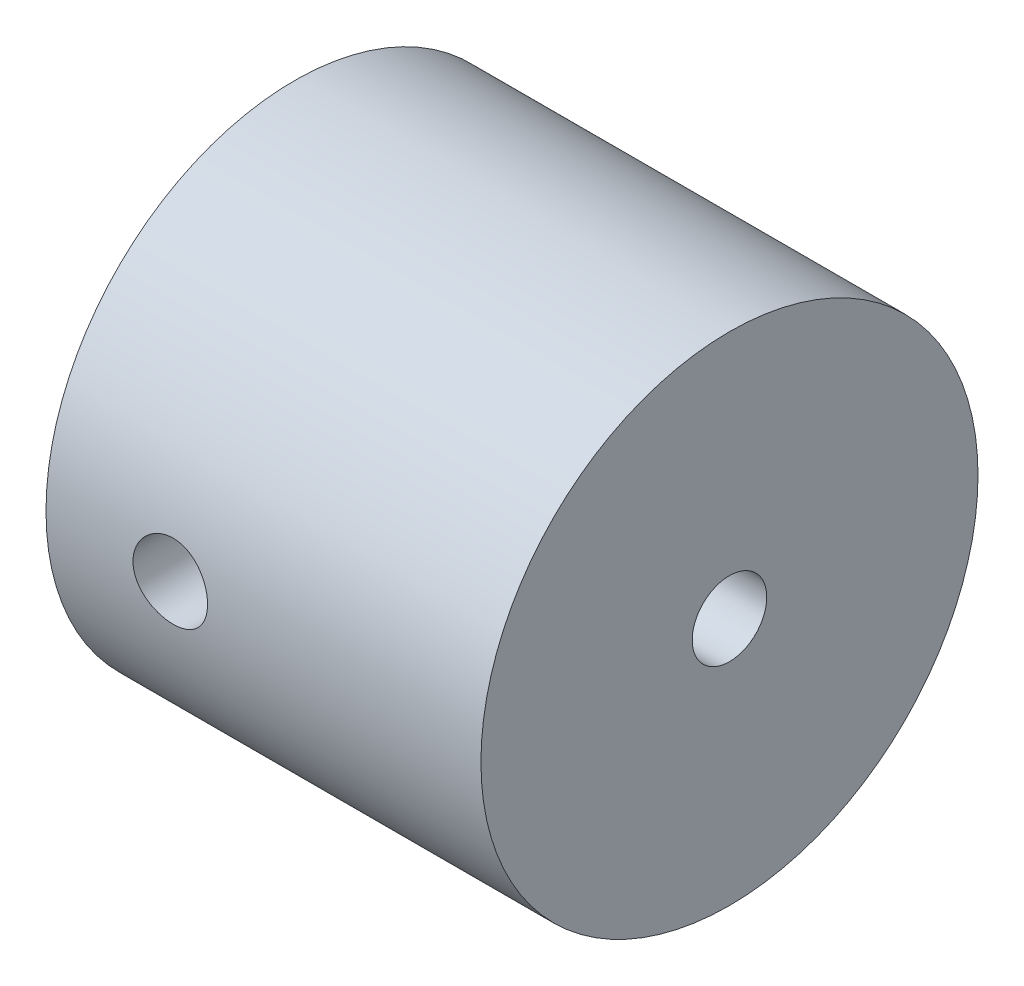
ISO-10303-21;
HEADER;
FILE_DESCRIPTION(('STEP AP214'),'2;1');
FILE_NAME('part.step','',(''),(''),'','','');
FILE_SCHEMA(('AUTOMOTIVE_DESIGN { 1 0 10303 214 1 1 1 1 }'));
ENDSEC;
DATA;
#1=APPLICATION_CONTEXT('core data for automotive mechanical design processes');
#2=APPLICATION_PROTOCOL_DEFINITION('international standard','automotive_design',2000,#1);
#3=PRODUCT_CONTEXT('',#1,'mechanical');
#4=PRODUCT('Part','Part','',(#3));
#5=PRODUCT_RELATED_PRODUCT_CATEGORY('part','',(#4));
#6=PRODUCT_DEFINITION_FORMATION('','',#4);
#7=PRODUCT_DEFINITION_CONTEXT('part definition',#1,'design');
#8=PRODUCT_DEFINITION('design','',#6,#7);
#9=PRODUCT_DEFINITION_SHAPE('','',#8);
#10=(LENGTH_UNIT() NAMED_UNIT(*) SI_UNIT(.MILLI.,.METRE.));
#11=(NAMED_UNIT(*) PLANE_ANGLE_UNIT() SI_UNIT($,.RADIAN.));
#12=(NAMED_UNIT(*) SI_UNIT($,.STERADIAN.) SOLID_ANGLE_UNIT());
#13=UNCERTAINTY_MEASURE_WITH_UNIT(LENGTH_MEASURE(1.E-05),#10,'distance_accuracy_value','');
#14=(GEOMETRIC_REPRESENTATION_CONTEXT(3) GLOBAL_UNCERTAINTY_ASSIGNED_CONTEXT((#13)) GLOBAL_UNIT_ASSIGNED_CONTEXT((#10,
#11,#12)) REPRESENTATION_CONTEXT('',''));
#15=CARTESIAN_POINT('',(0.,0.,0.));
#16=DIRECTION('',(0.,0.,1.));
#17=DIRECTION('',(1.,0.,0.));
#18=AXIS2_PLACEMENT_3D('',#15,#16,#17);
#19=CARTESIAN_POINT('',(10.,0.,0.));
#20=DIRECTION('',(-1.,0.,0.));
#21=DIRECTION('',(0.,0.,1.));
#22=AXIS2_PLACEMENT_3D('',#19,#20,#21);
#23=CYLINDRICAL_SURFACE('',#22,20.);
#24=CARTESIAN_POINT('',(-12.,0.,-20.));
#25=CARTESIAN_POINT('',(-12.0000069076305,0.167503088963284,-19.9999973154259));
#26=CARTESIAN_POINT('',(-12.0140760016813,0.335103370164263,-19.9978736507408));
#27=CARTESIAN_POINT('',(-12.0699663999655,0.665619255989825,-19.9896063194637));
#28=CARTESIAN_POINT('',(-12.1118147258898,0.828530137948457,-19.9834587387695));
#29=CARTESIAN_POINT('',(-12.2219850099352,1.14483617244372,-19.9678344243905));
#30=CARTESIAN_POINT('',(-12.2902869590119,1.2982384156536,-19.9583602074184));
#31=CARTESIAN_POINT('',(-12.4513767588337,1.59138085727051,-19.9371295182345));
#32=CARTESIAN_POINT('',(-12.5441612088347,1.73112294945038,-19.9253733630555));
#33=CARTESIAN_POINT('',(-12.7523545298797,1.99409343912425,-19.900783419829));
#34=CARTESIAN_POINT('',(-12.8679169124164,2.117199664451,-19.8879426778066));
#35=CARTESIAN_POINT('',(-13.1180553777877,2.34234981337897,-19.8626852226648));
#36=CARTESIAN_POINT('',(-13.252632553557,2.44439252545871,-19.8502685339701));
#37=CARTESIAN_POINT('',(-13.537801287045,2.62499458999886,-19.8271975491745));
#38=CARTESIAN_POINT('',(-13.6884684939627,2.7034357407441,-19.8165522395006));
#39=CARTESIAN_POINT('',(-14.0010256412909,2.83385264342112,-19.7983242261254));
#40=CARTESIAN_POINT('',(-14.1629149694878,2.88582983778326,-19.790741355509));
#41=CARTESIAN_POINT('',(-14.4920360837434,2.96146397597822,-19.7795651243735));
#42=CARTESIAN_POINT('',(-14.659218786816,2.98533007281035,-19.775942314825));
#43=CARTESIAN_POINT('',(-14.9952523319746,3.00471248067865,-19.7730069794116));
#44=CARTESIAN_POINT('',(-15.164103077725,3.00023041947592,-19.7736942060629));
#45=CARTESIAN_POINT('',(-15.4972021603883,2.96321466501575,-19.7792743670482));
#46=CARTESIAN_POINT('',(-15.6614770529696,2.93091391855501,-19.784132375231));
#47=CARTESIAN_POINT('',(-15.9822487377431,2.83954234807468,-19.7974521625273));
#48=CARTESIAN_POINT('',(-16.1387453097615,2.78047076675624,-19.8059140435876));
#49=CARTESIAN_POINT('',(-16.4402267425657,2.63699207059473,-19.8255267109096));
#50=CARTESIAN_POINT('',(-16.5851639381848,2.55248628566395,-19.8366879353305));
#51=CARTESIAN_POINT('',(-16.8588891915639,2.36060826257909,-19.860434151491));
#52=CARTESIAN_POINT('',(-16.9876761885387,2.25323452364956,-19.87301923665));
#53=CARTESIAN_POINT('',(-17.2267953214794,2.01738986156496,-19.8983494611242));
#54=CARTESIAN_POINT('',(-17.3369299805727,1.888718659284,-19.9110949422563));
#55=CARTESIAN_POINT('',(-17.5340718690145,1.61461417978837,-19.9351929529692));
#56=CARTESIAN_POINT('',(-17.6210789970878,1.46918082917634,-19.9465454764502));
#57=CARTESIAN_POINT('',(-17.7695061729991,1.16550919642737,-19.9665903117079));
#58=CARTESIAN_POINT('',(-17.8309109836806,1.00726335567356,-19.9752810385086));
#59=CARTESIAN_POINT('',(-17.9262187793707,0.682546364974121,-19.9890098111414));
#60=CARTESIAN_POINT('',(-17.9601236236311,0.516075771905201,-19.9940481039093));
#61=CARTESIAN_POINT('',(-17.9992064596334,0.181339135287294,-19.9998716226774));
#62=CARTESIAN_POINT('',(-18.0046559427586,0.0131054637409415,-20.0006970418078));
#63=CARTESIAN_POINT('',(-17.987393989378,-0.321873355324565,-19.9981112203045));
#64=CARTESIAN_POINT('',(-17.9646834246638,-0.488618548763754,-19.9947001108274));
#65=CARTESIAN_POINT('',(-17.8919717996449,-0.815064774862816,-19.9840493723067));
#66=CARTESIAN_POINT('',(-17.8421030079383,-0.974795926159676,-19.9768283041597));
#67=CARTESIAN_POINT('',(-17.7166300050765,-1.283629917286,-19.9593647131674));
#68=CARTESIAN_POINT('',(-17.6410245853327,-1.4327322575902,-19.9491220484313));
#69=CARTESIAN_POINT('',(-17.4655875508723,-1.71726995858384,-19.9266536493737));
#70=CARTESIAN_POINT('',(-17.3655837199745,-1.85259801978313,-19.9144140325349));
#71=CARTESIAN_POINT('',(-17.1444283767425,-2.10464734635541,-19.8893572602433));
#72=CARTESIAN_POINT('',(-17.0232756353507,-2.22136752958681,-19.8765400712573));
#73=CARTESIAN_POINT('',(-16.762052933647,-2.43387569914391,-19.8516452860899));
#74=CARTESIAN_POINT('',(-16.6218341496105,-2.52948169494842,-19.8395747203518));
#75=CARTESIAN_POINT('',(-16.3271679189765,-2.69578258541168,-19.8176643820981));
#76=CARTESIAN_POINT('',(-16.1727208569571,-2.76647815312871,-19.8078245493126));
#77=CARTESIAN_POINT('',(-15.8545249327537,-2.88066934647887,-19.7915406601729));
#78=CARTESIAN_POINT('',(-15.6908110780575,-2.92426074283271,-19.7850846601288));
#79=CARTESIAN_POINT('',(-15.3582819691298,-2.98331099003173,-19.776267645956));
#80=CARTESIAN_POINT('',(-15.1894670680106,-2.99877178366133,-19.7739063490354));
#81=CARTESIAN_POINT('',(-14.8533418733684,-3.00107573338879,-19.7735566522168));
#82=CARTESIAN_POINT('',(-14.6860335164862,-2.98820504334625,-19.77552452667));
#83=CARTESIAN_POINT('',(-14.355989473353,-2.93482459088757,-19.7835164122235));
#84=CARTESIAN_POINT('',(-14.1932537797732,-2.89431487277254,-19.7895404168224));
#85=CARTESIAN_POINT('',(-13.8770538355314,-2.7869074703733,-19.8049505222459));
#86=CARTESIAN_POINT('',(-13.7235826591331,-2.72002978648628,-19.8143340743215));
#87=CARTESIAN_POINT('',(-13.4299927323952,-2.56181335284618,-19.835409091154));
#88=CARTESIAN_POINT('',(-13.2898744343927,-2.47047377483004,-19.8471006340545));
#89=CARTESIAN_POINT('',(-13.0255138840497,-2.26488675318328,-19.8716148672988));
#90=CARTESIAN_POINT('',(-12.9014373335059,-2.15042738079611,-19.8844473576393));
#91=CARTESIAN_POINT('',(-12.6741508904244,-1.90229768216567,-19.9097157765327));
#92=CARTESIAN_POINT('',(-12.5709458548477,-1.76862289670188,-19.9221516122152));
#93=CARTESIAN_POINT('',(-12.3878246467853,-1.48499141508744,-19.9453037158104));
#94=CARTESIAN_POINT('',(-12.3080397815705,-1.33494915352952,-19.9560101425764));
#95=CARTESIAN_POINT('',(-12.1749229664839,-1.02350374049744,-19.9744005760592));
#96=CARTESIAN_POINT('',(-12.1215636198926,-0.862112554193405,-19.9820877113151));
#97=CARTESIAN_POINT('',(-12.0549173145798,-0.583331455778657,-19.9918187852301));
#98=CARTESIAN_POINT('',(-12.0343547969224,-0.467662266990557,-19.9948709835911));
#99=CARTESIAN_POINT('',(-12.0068938045747,-0.234677943200251,-19.9989625189579));
#100=CARTESIAN_POINT('',(-11.9999951600949,-0.117362828668835,-20.0000018809755));
#101=CARTESIAN_POINT('',(-12.,0.,-20.));
#102=B_SPLINE_CURVE_WITH_KNOTS('',3,(#24,#25,#26,#27,#28,#29,#30,#31,#32,#33,#34,#35,#36,#37,
#38,#39,#40,#41,#42,#43,#44,#45,#46,#47,#48,#49,#50,#51,#52,#53,#54,#55,#56,#57,#58,#59,#60,#61,
#62,#63,#64,#65,#66,#67,#68,#69,#70,#71,#72,#73,#74,#75,#76,#77,#78,#79,#80,#81,#82,#83,#84,#85,
#86,#87,#88,#89,#90,#91,#92,#93,#94,#95,#96,#97,#98,#99,#100,#101),.UNSPECIFIED.,.T.,.F.,(4,2,2,
2,2,2,2,2,2,2,2,2,2,2,2,2,2,2,2,2,2,2,2,2,2,2,2,2,2,2,2,2,2,2,2,2,2,2,4),(0.,0.502080410063326,
1.0046499258583,1.50684004716647,2.0089604483952,2.51458832273687,3.0202452714516,
3.5283940479075,4.03651512451012,4.54083129211848,5.04511850197964,5.54522354391493,
6.04534273380723,6.54742766952318,7.04954556617068,7.55668582510817,8.06382830477336,
8.57127217969748,9.07868174386802,9.5812411708851,10.0837850398231,10.583902979319,
11.0840444075255,11.5878237607381,12.0916324005726,12.5996273316934,13.1076085361766,
13.6137844691434,14.1199254427435,14.6209777652213,15.1220292845913,15.6227014796829,
16.1233906293376,16.6288965993144,17.1345200693747,17.6429264676947,18.1508046652288,
18.5025970395762,18.8543850424658),.UNSPECIFIED.);
#103=CARTESIAN_POINT('',(-12.,0.,-20.));
#104=VERTEX_POINT('',#103);
#105=EDGE_CURVE('E86',#104,#104,#102,.T.);
#106=ORIENTED_EDGE('',*,*,#105,.T.);
#107=EDGE_LOOP('',(#106));
#108=FACE_BOUND('',#107,.T.);
#109=CARTESIAN_POINT('',(-12.,0.,20.));
#110=CARTESIAN_POINT('',(-12.0000069076305,-0.167503088963284,19.9999973154259));
#111=CARTESIAN_POINT('',(-12.0140760016813,-0.335103370164263,19.9978736507408));
#112=CARTESIAN_POINT('',(-12.0699663999655,-0.665619255989825,19.9896063194637));
#113=CARTESIAN_POINT('',(-12.1118147258898,-0.828530137948457,19.9834587387695));
#114=CARTESIAN_POINT('',(-12.2219850099352,-1.14483617244372,19.9678344243905));
#115=CARTESIAN_POINT('',(-12.2902869590119,-1.2982384156536,19.9583602074184));
#116=CARTESIAN_POINT('',(-12.4513767588337,-1.59138085727051,19.9371295182345));
#117=CARTESIAN_POINT('',(-12.5441612088347,-1.73112294945038,19.9253733630555));
#118=CARTESIAN_POINT('',(-12.7523545298797,-1.99409343912425,19.900783419829));
#119=CARTESIAN_POINT('',(-12.8679169124164,-2.117199664451,19.8879426778066));
#120=CARTESIAN_POINT('',(-13.1180553777877,-2.34234981337897,19.8626852226648));
#121=CARTESIAN_POINT('',(-13.252632553557,-2.44439252545871,19.8502685339701));
#122=CARTESIAN_POINT('',(-13.537801287045,-2.62499458999886,19.8271975491745));
#123=CARTESIAN_POINT('',(-13.6884684939627,-2.7034357407441,19.8165522395006));
#124=CARTESIAN_POINT('',(-14.0010256412909,-2.83385264342112,19.7983242261254));
#125=CARTESIAN_POINT('',(-14.1629149694878,-2.88582983778326,19.790741355509));
#126=CARTESIAN_POINT('',(-14.4920360837434,-2.96146397597822,19.7795651243735));
#127=CARTESIAN_POINT('',(-14.659218786816,-2.98533007281035,19.775942314825));
#128=CARTESIAN_POINT('',(-14.9952523319746,-3.00471248067865,19.7730069794116));
#129=CARTESIAN_POINT('',(-15.164103077725,-3.00023041947592,19.7736942060629));
#130=CARTESIAN_POINT('',(-15.4972021603883,-2.96321466501575,19.7792743670482));
#131=CARTESIAN_POINT('',(-15.6614770529696,-2.93091391855501,19.784132375231));
#132=CARTESIAN_POINT('',(-15.9822487377431,-2.83954234807468,19.7974521625273));
#133=CARTESIAN_POINT('',(-16.1387453097615,-2.78047076675624,19.8059140435876));
#134=CARTESIAN_POINT('',(-16.4402267425657,-2.63699207059473,19.8255267109096));
#135=CARTESIAN_POINT('',(-16.5851639381848,-2.55248628566395,19.8366879353305));
#136=CARTESIAN_POINT('',(-16.8588891915639,-2.36060826257909,19.860434151491));
#137=CARTESIAN_POINT('',(-16.9876761885387,-2.25323452364956,19.87301923665));
#138=CARTESIAN_POINT('',(-17.2267953214794,-2.01738986156496,19.8983494611242));
#139=CARTESIAN_POINT('',(-17.3369299805727,-1.888718659284,19.9110949422563));
#140=CARTESIAN_POINT('',(-17.5340718690145,-1.61461417978837,19.9351929529692));
#141=CARTESIAN_POINT('',(-17.6210789970878,-1.46918082917634,19.9465454764502));
#142=CARTESIAN_POINT('',(-17.7695061729991,-1.16550919642737,19.9665903117079));
#143=CARTESIAN_POINT('',(-17.8309109836806,-1.00726335567356,19.9752810385086));
#144=CARTESIAN_POINT('',(-17.9262187793707,-0.682546364974121,19.9890098111414));
#145=CARTESIAN_POINT('',(-17.9601236236311,-0.516075771905201,19.9940481039093));
#146=CARTESIAN_POINT('',(-17.9992064596334,-0.181339135287294,19.9998716226774));
#147=CARTESIAN_POINT('',(-18.0046559427586,-0.0131054637409415,20.0006970418078));
#148=CARTESIAN_POINT('',(-17.987393989378,0.321873355324565,19.9981112203045));
#149=CARTESIAN_POINT('',(-17.9646834246638,0.488618548763754,19.9947001108274));
#150=CARTESIAN_POINT('',(-17.8919717996449,0.815064774862816,19.9840493723067));
#151=CARTESIAN_POINT('',(-17.8421030079383,0.974795926159676,19.9768283041597));
#152=CARTESIAN_POINT('',(-17.7166300050765,1.283629917286,19.9593647131674));
#153=CARTESIAN_POINT('',(-17.6410245853327,1.4327322575902,19.9491220484313));
#154=CARTESIAN_POINT('',(-17.4655875508723,1.71726995858384,19.9266536493737));
#155=CARTESIAN_POINT('',(-17.3655837199745,1.85259801978313,19.9144140325349));
#156=CARTESIAN_POINT('',(-17.1444283767425,2.10464734635541,19.8893572602433));
#157=CARTESIAN_POINT('',(-17.0232756353507,2.22136752958681,19.8765400712573));
#158=CARTESIAN_POINT('',(-16.762052933647,2.43387569914391,19.8516452860899));
#159=CARTESIAN_POINT('',(-16.6218341496105,2.52948169494842,19.8395747203518));
#160=CARTESIAN_POINT('',(-16.3271679189765,2.69578258541168,19.8176643820981));
#161=CARTESIAN_POINT('',(-16.1727208569571,2.76647815312871,19.8078245493126));
#162=CARTESIAN_POINT('',(-15.8545249327537,2.88066934647887,19.7915406601729));
#163=CARTESIAN_POINT('',(-15.6908110780575,2.92426074283271,19.7850846601288));
#164=CARTESIAN_POINT('',(-15.3582819691298,2.98331099003173,19.776267645956));
#165=CARTESIAN_POINT('',(-15.1894670680106,2.99877178366133,19.7739063490354));
#166=CARTESIAN_POINT('',(-14.8533418733684,3.00107573338879,19.7735566522168));
#167=CARTESIAN_POINT('',(-14.6860335164862,2.98820504334625,19.77552452667));
#168=CARTESIAN_POINT('',(-14.355989473353,2.93482459088757,19.7835164122235));
#169=CARTESIAN_POINT('',(-14.1932537797732,2.89431487277254,19.7895404168224));
#170=CARTESIAN_POINT('',(-13.8770538355314,2.7869074703733,19.8049505222459));
#171=CARTESIAN_POINT('',(-13.7235826591331,2.72002978648628,19.8143340743215));
#172=CARTESIAN_POINT('',(-13.4299927323952,2.56181335284618,19.835409091154));
#173=CARTESIAN_POINT('',(-13.2898744343927,2.47047377483004,19.8471006340545));
#174=CARTESIAN_POINT('',(-13.0255138840497,2.26488675318328,19.8716148672988));
#175=CARTESIAN_POINT('',(-12.9014373335059,2.15042738079611,19.8844473576393));
#176=CARTESIAN_POINT('',(-12.6741508904244,1.90229768216567,19.9097157765327));
#177=CARTESIAN_POINT('',(-12.5709458548477,1.76862289670188,19.9221516122152));
#178=CARTESIAN_POINT('',(-12.3878246467853,1.48499141508744,19.9453037158104));
#179=CARTESIAN_POINT('',(-12.3080397815705,1.33494915352952,19.9560101425764));
#180=CARTESIAN_POINT('',(-12.1749229664839,1.02350374049744,19.9744005760592));
#181=CARTESIAN_POINT('',(-12.1215636198926,0.862112554193405,19.9820877113151));
#182=CARTESIAN_POINT('',(-12.0549173145798,0.583331455778657,19.9918187852301));
#183=CARTESIAN_POINT('',(-12.0343547969224,0.467662266990557,19.9948709835911));
#184=CARTESIAN_POINT('',(-12.0068938045747,0.234677943200251,19.9989625189579));
#185=CARTESIAN_POINT('',(-11.9999951600949,0.117362828668835,20.0000018809755));
#186=CARTESIAN_POINT('',(-12.,0.,20.));
#187=B_SPLINE_CURVE_WITH_KNOTS('',3,(#109,#110,#111,#112,#113,#114,#115,#116,#117,#118,#119,
#120,#121,#122,#123,#124,#125,#126,#127,#128,#129,#130,#131,#132,#133,#134,#135,#136,#137,#138,
#139,#140,#141,#142,#143,#144,#145,#146,#147,#148,#149,#150,#151,#152,#153,#154,#155,#156,#157,
#158,#159,#160,#161,#162,#163,#164,#165,#166,#167,#168,#169,#170,#171,#172,#173,#174,#175,#176,
#177,#178,#179,#180,#181,#182,#183,#184,#185,#186),.UNSPECIFIED.,.T.,.F.,(4,2,2,2,2,2,2,2,2,2,2,
2,2,2,2,2,2,2,2,2,2,2,2,2,2,2,2,2,2,2,2,2,2,2,2,2,2,2,4),(0.,0.502080410063326,1.0046499258583,
1.50684004716647,2.0089604483952,2.51458832273687,3.0202452714516,3.5283940479075,
4.03651512451012,4.54083129211848,5.04511850197964,5.54522354391493,6.04534273380723,
6.54742766952318,7.04954556617068,7.55668582510817,8.06382830477336,8.57127217969748,
9.07868174386802,9.5812411708851,10.0837850398231,10.583902979319,11.0840444075255,
11.5878237607381,12.0916324005726,12.5996273316934,13.1076085361766,13.6137844691434,
14.1199254427435,14.6209777652213,15.1220292845913,15.6227014796829,16.1233906293376,
16.6288965993144,17.1345200693747,17.6429264676947,18.1508046652288,18.5025970395762,
18.8543850424658),.UNSPECIFIED.);
#188=CARTESIAN_POINT('',(-12.,0.,20.));
#189=VERTEX_POINT('',#188);
#190=EDGE_CURVE('E80',#189,#189,#187,.T.);
#191=ORIENTED_EDGE('',*,*,#190,.T.);
#192=EDGE_LOOP('',(#191));
#193=FACE_BOUND('',#192,.T.);
#194=CARTESIAN_POINT('',(10.,0.,0.));
#195=DIRECTION('',(1.,0.,0.));
#196=DIRECTION('',(0.,0.,-1.));
#197=AXIS2_PLACEMENT_3D('',#194,#195,#196);
#198=CIRCLE('',#197,20.);
#199=CARTESIAN_POINT('',(10.,0.,-20.));
#200=VERTEX_POINT('',#199);
#201=EDGE_CURVE('E10',#200,#200,#198,.T.);
#202=ORIENTED_EDGE('',*,*,#201,.F.);
#203=EDGE_LOOP('',(#202));
#204=FACE_BOUND('',#203,.T.);
#205=CARTESIAN_POINT('',(-25.,0.,0.));
#206=DIRECTION('',(-1.,0.,0.));
#207=DIRECTION('',(0.,0.,1.));
#208=AXIS2_PLACEMENT_3D('',#205,#206,#207);
#209=CIRCLE('',#208,20.);
#210=CARTESIAN_POINT('',(-25.,0.,20.));
#211=VERTEX_POINT('',#210);
#212=EDGE_CURVE('E50',#211,#211,#209,.T.);
#213=ORIENTED_EDGE('',*,*,#212,.F.);
#214=EDGE_LOOP('',(#213));
#215=FACE_BOUND('',#214,.T.);
#216=ADVANCED_FACE('F36',(#108,#193,#204,#215),#23,.T.);
#217=CARTESIAN_POINT('',(10.,0.,0.));
#218=DIRECTION('',(1.,0.,0.));
#219=DIRECTION('',(0.,0.,-1.));
#220=AXIS2_PLACEMENT_3D('',#217,#218,#219);
#221=PLANE('',#220);
#222=CARTESIAN_POINT('',(10.,0.,0.));
#223=DIRECTION('',(1.,0.,0.));
#224=DIRECTION('',(0.,0.,-1.));
#225=AXIS2_PLACEMENT_3D('',#222,#223,#224);
#226=CIRCLE('',#225,3.);
#227=CARTESIAN_POINT('',(10.,0.,-3.));
#228=VERTEX_POINT('',#227);
#229=EDGE_CURVE('E93',#228,#228,#226,.T.);
#230=ORIENTED_EDGE('',*,*,#229,.F.);
#231=EDGE_LOOP('',(#230));
#232=FACE_BOUND('',#231,.T.);
#233=ORIENTED_EDGE('',*,*,#201,.T.);
#234=EDGE_LOOP('',(#233));
#235=FACE_BOUND('',#234,.T.);
#236=ADVANCED_FACE('F120',(#232,#235),#221,.T.);
#237=CARTESIAN_POINT('',(-25.,0.,0.));
#238=DIRECTION('',(-1.,0.,0.));
#239=DIRECTION('',(0.,0.,1.));
#240=AXIS2_PLACEMENT_3D('',#237,#238,#239);
#241=PLANE('',#240);
#242=ORIENTED_EDGE('',*,*,#212,.T.);
#243=EDGE_LOOP('',(#242));
#244=FACE_BOUND('',#243,.T.);
#245=CARTESIAN_POINT('',(-25.,0.,0.));
#246=DIRECTION('',(-1.,0.,0.));
#247=DIRECTION('',(0.,0.,1.));
#248=AXIS2_PLACEMENT_3D('',#245,#246,#247);
#249=CIRCLE('',#248,7.);
#250=CARTESIAN_POINT('',(-25.,0.,7.));
#251=VERTEX_POINT('',#250);
#252=EDGE_CURVE('E56',#251,#251,#249,.T.);
#253=ORIENTED_EDGE('',*,*,#252,.F.);
#254=EDGE_LOOP('',(#253));
#255=FACE_BOUND('',#254,.T.);
#256=ADVANCED_FACE('F111',(#244,#255),#241,.T.);
#257=CARTESIAN_POINT('',(-25.,0.,0.));
#258=DIRECTION('',(1.,0.,0.));
#259=DIRECTION('',(0.,0.,-1.));
#260=AXIS2_PLACEMENT_3D('',#257,#258,#259);
#261=CYLINDRICAL_SURFACE('',#260,7.);
#262=CARTESIAN_POINT('',(-18.,0.,-7.));
#263=CARTESIAN_POINT('',(-17.9999925304185,-0.160281740269091,-6.9999940839629));
#264=CARTESIAN_POINT('',(-17.9870786839035,-0.320833907522429,-6.99443250051265));
#265=CARTESIAN_POINT('',(-17.9359176345735,-0.637349314958984,-6.97273920628719));
#266=CARTESIAN_POINT('',(-17.8976064709266,-0.793299928144206,-6.95658080950724));
#267=CARTESIAN_POINT('',(-17.7973302363749,-1.09553470514829,-6.91541630739346));
#268=CARTESIAN_POINT('',(-17.7354471561946,-1.24185033642246,-6.89044089228941));
#269=CARTESIAN_POINT('',(-17.5901355814363,-1.5218733278968,-6.83405660276648));
#270=CARTESIAN_POINT('',(-17.5067129239082,-1.65558409053381,-6.80264947176647));
#271=CARTESIAN_POINT('',(-17.3160723523121,-1.91384144205639,-6.7346782187555));
#272=CARTESIAN_POINT('',(-17.2079047401042,-2.03764045493602,-6.69793895962371));
#273=CARTESIAN_POINT('',(-16.9728561314992,-2.26599040232609,-6.62417654338771));
#274=CARTESIAN_POINT('',(-16.8459648153973,-2.3705306503261,-6.5871532404671));
#275=CARTESIAN_POINT('',(-16.5689672772845,-2.56285686126492,-6.51482055271223));
#276=CARTESIAN_POINT('',(-16.4179895419707,-2.64946811752636,-6.47970460244924));
#277=CARTESIAN_POINT('',(-16.101890571811,-2.795731994081,-6.41796168635027));
#278=CARTESIAN_POINT('',(-15.9367770955138,-2.8553992914263,-6.39133010120133));
#279=CARTESIAN_POINT('',(-15.6056992616908,-2.94294919918374,-6.35147799087276));
#280=CARTESIAN_POINT('',(-15.4401922982205,-2.97227494401776,-6.3376522143554));
#281=CARTESIAN_POINT('',(-15.1060740303897,-3.00280607158394,-6.32324849688131));
#282=CARTESIAN_POINT('',(-14.9374646447086,-3.00402828615096,-6.32266262625149));
#283=CARTESIAN_POINT('',(-14.6167000962814,-2.97939999510613,-6.33429573902539));
#284=CARTESIAN_POINT('',(-14.464329376668,-2.95576113815072,-6.34546870930158));
#285=CARTESIAN_POINT('',(-14.1659724140987,-2.88580772808799,-6.37758411517576));
#286=CARTESIAN_POINT('',(-14.0199874861139,-2.83948852833538,-6.39852855266591));
#287=CARTESIAN_POINT('',(-13.7347528485648,-2.7245765907069,-6.44830685655466));
#288=CARTESIAN_POINT('',(-13.5957197057819,-2.65551974428426,-6.47730295111391));
#289=CARTESIAN_POINT('',(-13.3306536759306,-2.49742304873013,-6.53988493882129));
#290=CARTESIAN_POINT('',(-13.2046261050705,-2.40837507480489,-6.57347269593628));
#291=CARTESIAN_POINT('',(-12.9572224963786,-2.20343405392229,-6.64512404535213));
#292=CARTESIAN_POINT('',(-12.837283270528,-2.08584728856133,-6.68331855389209));
#293=CARTESIAN_POINT('',(-12.6183284093441,-1.83187332405076,-6.75734605758523));
#294=CARTESIAN_POINT('',(-12.5193182541218,-1.69548121627989,-6.79317843254652));
#295=CARTESIAN_POINT('',(-12.342756067193,-1.40318582301271,-6.8595969368957));
#296=CARTESIAN_POINT('',(-12.2658209812944,-1.24687114970231,-6.89002455033727));
#297=CARTESIAN_POINT('',(-12.1398497623853,-0.921879694158935,-6.94097396260558));
#298=CARTESIAN_POINT('',(-12.0907972940223,-0.753210215657665,-6.96150156039981));
#299=CARTESIAN_POINT('',(-12.025066139541,-0.42027623894137,-6.98923526893385));
#300=CARTESIAN_POINT('',(-12.0064612346856,-0.256457961010924,-6.99723249964589));
#301=CARTESIAN_POINT('',(-11.9963704235918,0.0721433011185074,-7.00155416651738));
#302=CARTESIAN_POINT('',(-12.0048761474676,0.236925971900557,-6.99788220531666));
#303=CARTESIAN_POINT('',(-12.0474156320548,0.553542439626673,-6.9797867632015));
#304=CARTESIAN_POINT('',(-12.0800683214483,0.705598931504219,-6.96594519473644));
#305=CARTESIAN_POINT('',(-12.1680208942382,1.00189113639242,-6.92953888009974));
#306=CARTESIAN_POINT('',(-12.2233235957222,1.14612587370002,-6.90697304848521));
#307=CARTESIAN_POINT('',(-12.3568011595021,1.42777696523888,-6.8543875151372));
#308=CARTESIAN_POINT('',(-12.4356363302261,1.56483974951836,-6.82415705388474));
#309=CARTESIAN_POINT('',(-12.6132189444759,1.82428490564705,-6.75942988391438));
#310=CARTESIAN_POINT('',(-12.7119748880233,1.94666097512992,-6.72493135648758));
#311=CARTESIAN_POINT('',(-12.9352895878429,2.18296759532595,-6.65214788697903));
#312=CARTESIAN_POINT('',(-13.0612322100614,2.29556617553686,-6.61377354998591));
#313=CARTESIAN_POINT('',(-13.3307822986316,2.49843431443676,-6.53984037690253));
#314=CARTESIAN_POINT('',(-13.4743946603748,2.58869766421195,-6.50428232556792));
#315=CARTESIAN_POINT('',(-13.7788138529586,2.74563875632303,-6.43962969285319));
#316=CARTESIAN_POINT('',(-13.93988300905,2.81186415020233,-6.41066255987443));
#317=CARTESIAN_POINT('',(-14.2725263267395,2.91565885028324,-6.36413607530145));
#318=CARTESIAN_POINT('',(-14.4440909983246,2.95325364225748,-6.346566580073));
#319=CARTESIAN_POINT('',(-14.7779911723329,2.9961194841997,-6.32643481136621));
#320=CARTESIAN_POINT('',(-14.9399592675106,3.00374693238451,-6.3227792566546));
#321=CARTESIAN_POINT('',(-15.2627897469115,2.99282649265778,-6.32795618271386));
#322=CARTESIAN_POINT('',(-15.4236523211193,2.97428322126543,-6.33678646098226));
#323=CARTESIAN_POINT('',(-15.7310416962734,2.91356431394149,-6.36491653890771));
#324=CARTESIAN_POINT('',(-15.8778787915708,2.87266975661121,-6.38364713099396));
#325=CARTESIAN_POINT('',(-16.1626207660839,2.769702223632,-6.42898875831973));
#326=CARTESIAN_POINT('',(-16.3005230924077,2.70762322652258,-6.45560203384715));
#327=CARTESIAN_POINT('',(-16.5728207086796,2.55963250501149,-6.5157524732596));
#328=CARTESIAN_POINT('',(-16.7064691536948,2.47248232196069,-6.5496164957701));
#329=CARTESIAN_POINT('',(-16.9579823612475,2.2784960092513,-6.61959778926567));
#330=CARTESIAN_POINT('',(-17.0758411270492,2.17165243666714,-6.6557159087398));
#331=CARTESIAN_POINT('',(-17.3020036355007,1.93135048700133,-6.72955424641834));
#332=CARTESIAN_POINT('',(-17.4088195655728,1.79645724733279,-6.76717599448736));
#333=CARTESIAN_POINT('',(-17.5984397600312,1.50919760355001,-6.83696477009089));
#334=CARTESIAN_POINT('',(-17.6812331375999,1.35682332068822,-6.86912932173673));
#335=CARTESIAN_POINT('',(-17.7845926909895,1.11954532843042,-6.91035442086788));
#336=CARTESIAN_POINT('',(-17.8154332908018,1.03957288024831,-6.92286397965452));
#337=CARTESIAN_POINT('',(-17.8702382020223,0.876970802782697,-6.94533202163241));
#338=CARTESIAN_POINT('',(-17.8942057922754,0.794342461515167,-6.95529172101821));
#339=CARTESIAN_POINT('',(-17.9349477172834,0.627265567421398,-6.97234378079151));
#340=CARTESIAN_POINT('',(-17.9517395843805,0.542821986677288,-6.97944312738119));
#341=CARTESIAN_POINT('',(-17.9780087142034,0.372647906839316,-6.99059319635283));
#342=CARTESIAN_POINT('',(-17.9874912240139,0.286918376030205,-6.99464610559385));
#343=CARTESIAN_POINT('',(-17.9955082749436,0.167492669563774,-6.99807592564235));
#344=CARTESIAN_POINT('',(-17.9971918541176,0.134021137958664,-6.99879677015532));
#345=CARTESIAN_POINT('',(-17.9994385012841,0.0670370145842099,-6.99975942751561));
#346=CARTESIAN_POINT('',(-18.0000015623327,0.0335244225617052,-7.0000012373944));
#347=CARTESIAN_POINT('',(-18.,0.,-7.));
#348=B_SPLINE_CURVE_WITH_KNOTS('',3,(#262,#263,#264,#265,#266,#267,#268,#269,#270,#271,#272,
#273,#274,#275,#276,#277,#278,#279,#280,#281,#282,#283,#284,#285,#286,#287,#288,#289,#290,#291,
#292,#293,#294,#295,#296,#297,#298,#299,#300,#301,#302,#303,#304,#305,#306,#307,#308,#309,#310,
#311,#312,#313,#314,#315,#316,#317,#318,#319,#320,#321,#322,#323,#324,#325,#326,#327,#328,#329,
#330,#331,#332,#333,#334,#335,#336,#337,#338,#339,#340,#341,#342,#343,#344,#345,#346,#347),
.UNSPECIFIED.,.T.,.F.,(4,2,2,2,2,2,2,2,2,2,2,2,2,2,2,2,2,2,2,2,2,2,2,2,2,2,2,2,2,2,2,2,2,2,2,2,
2,2,2,2,2,2,4),(0.,0.480714322748849,0.962643903423346,1.44291226275142,1.92305060961531,
2.42622743558506,2.92968263421743,3.45969560860062,3.98941952228263,4.492594268281,
4.99546764377914,5.45710720323576,5.91884138089948,6.3906540887232,6.86265889892285,
7.37709837725841,7.89167239108963,8.41947244601234,8.94696296364742,9.43957347502027,
9.93203191709568,10.3983119423363,10.8646499992176,11.3455505516221,11.8266567358409,
12.3440285038672,12.8615439335848,13.3883469079738,13.9146803943341,14.3986848887267,
14.882604015318,15.341320451094,15.8001673810816,16.2874475008663,16.7749121624767,
17.3008416934143,17.8270092002163,18.0865840789243,18.3460349177801,18.6048481685098,
18.8634754544625,18.9640207205289,19.0645666096629),.UNSPECIFIED.);
#349=CARTESIAN_POINT('',(-18.,0.,-7.));
#350=VERTEX_POINT('',#349);
#351=EDGE_CURVE('E40',#350,#350,#348,.T.);
#352=ORIENTED_EDGE('',*,*,#351,.F.);
#353=EDGE_LOOP('',(#352));
#354=FACE_BOUND('',#353,.T.);
#355=CARTESIAN_POINT('',(-12.,0.,7.));
#356=CARTESIAN_POINT('',(-12.0000074695815,-0.160281740269091,6.9999940839629));
#357=CARTESIAN_POINT('',(-12.0129213160965,-0.320833907522429,6.99443250051265));
#358=CARTESIAN_POINT('',(-12.0640823654265,-0.637349314958984,6.97273920628719));
#359=CARTESIAN_POINT('',(-12.1023935290733,-0.793299928144206,6.95658080950724));
#360=CARTESIAN_POINT('',(-12.2026697636251,-1.09553470514829,6.91541630739346));
#361=CARTESIAN_POINT('',(-12.2645528438054,-1.24185033642246,6.89044089228941));
#362=CARTESIAN_POINT('',(-12.4098644185637,-1.5218733278968,6.83405660276648));
#363=CARTESIAN_POINT('',(-12.4932870760918,-1.6555840905338,6.80264947176647));
#364=CARTESIAN_POINT('',(-12.6839276476879,-1.91384144205638,6.7346782187555));
#365=CARTESIAN_POINT('',(-12.7920952598958,-2.03764045493602,6.69793895962371));
#366=CARTESIAN_POINT('',(-13.0271438685008,-2.26599040232609,6.62417654338771));
#367=CARTESIAN_POINT('',(-13.1540351846027,-2.3705306503261,6.5871532404671));
#368=CARTESIAN_POINT('',(-13.4310327227155,-2.56285686126492,6.51482055271223));
#369=CARTESIAN_POINT('',(-13.5820104580293,-2.64946811752636,6.47970460244924));
#370=CARTESIAN_POINT('',(-13.898109428189,-2.79573199408101,6.41796168635027));
#371=CARTESIAN_POINT('',(-14.0632229044862,-2.8553992914263,6.39133010120133));
#372=CARTESIAN_POINT('',(-14.3943007383092,-2.94294919918374,6.35147799087276));
#373=CARTESIAN_POINT('',(-14.5598077017795,-2.97227494401776,6.3376522143554));
#374=CARTESIAN_POINT('',(-14.8939259696103,-3.00280607158394,6.32324849688131));
#375=CARTESIAN_POINT('',(-15.0625353552914,-3.00402828615096,6.32266262625149));
#376=CARTESIAN_POINT('',(-15.3832999037186,-2.97939999510613,6.33429573902539));
#377=CARTESIAN_POINT('',(-15.535670623332,-2.95576113815072,6.34546870930158));
#378=CARTESIAN_POINT('',(-15.8340275859013,-2.88580772808799,6.37758411517576));
#379=CARTESIAN_POINT('',(-15.9800125138861,-2.83948852833539,6.39852855266591));
#380=CARTESIAN_POINT('',(-16.2652471514352,-2.7245765907069,6.44830685655466));
#381=CARTESIAN_POINT('',(-16.4042802942181,-2.65551974428426,6.47730295111391));
#382=CARTESIAN_POINT('',(-16.6693463240694,-2.49742304873013,6.53988493882129));
#383=CARTESIAN_POINT('',(-16.7953738949295,-2.40837507480489,6.57347269593628));
#384=CARTESIAN_POINT('',(-17.0427775036214,-2.20343405392229,6.64512404535213));
#385=CARTESIAN_POINT('',(-17.162716729472,-2.08584728856133,6.68331855389208));
#386=CARTESIAN_POINT('',(-17.3816715906559,-1.83187332405077,6.75734605758523));
#387=CARTESIAN_POINT('',(-17.4806817458782,-1.6954812162799,6.79317843254652));
#388=CARTESIAN_POINT('',(-17.657243932807,-1.40318582301271,6.8595969368957));
#389=CARTESIAN_POINT('',(-17.7341790187056,-1.24687114970231,6.89002455033727));
#390=CARTESIAN_POINT('',(-17.8601502376147,-0.921879694158934,6.94097396260558));
#391=CARTESIAN_POINT('',(-17.9092027059777,-0.753210215657663,6.96150156039981));
#392=CARTESIAN_POINT('',(-17.974933860459,-0.420276238941368,6.98923526893385));
#393=CARTESIAN_POINT('',(-17.9935387653144,-0.256457961010923,6.99723249964589));
#394=CARTESIAN_POINT('',(-18.0036295764082,0.0721433011185075,7.00155416651738));
#395=CARTESIAN_POINT('',(-17.9951238525324,0.236925971900556,6.99788220531666));
#396=CARTESIAN_POINT('',(-17.9525843679452,0.553542439626672,6.9797867632015));
#397=CARTESIAN_POINT('',(-17.9199316785517,0.705598931504218,6.96594519473644));
#398=CARTESIAN_POINT('',(-17.8319791057618,1.00189113639242,6.92953888009974));
#399=CARTESIAN_POINT('',(-17.7766764042778,1.14612587370002,6.90697304848521));
#400=CARTESIAN_POINT('',(-17.6431988404979,1.42777696523888,6.8543875151372));
#401=CARTESIAN_POINT('',(-17.5643636697739,1.56483974951836,6.82415705388474));
#402=CARTESIAN_POINT('',(-17.3867810555241,1.82428490564705,6.75942988391438));
#403=CARTESIAN_POINT('',(-17.2880251119767,1.94666097512992,6.72493135648758));
#404=CARTESIAN_POINT('',(-17.0647104121571,2.18296759532595,6.65214788697903));
#405=CARTESIAN_POINT('',(-16.9387677899386,2.29556617553686,6.61377354998591));
#406=CARTESIAN_POINT('',(-16.6692177013684,2.49843431443676,6.53984037690252));
#407=CARTESIAN_POINT('',(-16.5256053396252,2.58869766421195,6.50428232556792));
#408=CARTESIAN_POINT('',(-16.2211861470414,2.74563875632303,6.4396296928532));
#409=CARTESIAN_POINT('',(-16.06011699095,2.81186415020233,6.41066255987443));
#410=CARTESIAN_POINT('',(-15.7274736732605,2.91565885028324,6.36413607530145));
#411=CARTESIAN_POINT('',(-15.5559090016754,2.95325364225748,6.346566580073));
#412=CARTESIAN_POINT('',(-15.2220088276671,2.9961194841997,6.32643481136621));
#413=CARTESIAN_POINT('',(-15.0600407324894,3.00374693238451,6.3227792566546));
#414=CARTESIAN_POINT('',(-14.7372102530885,2.99282649265777,6.32795618271386));
#415=CARTESIAN_POINT('',(-14.5763476788807,2.97428322126543,6.33678646098226));
#416=CARTESIAN_POINT('',(-14.2689583037266,2.91356431394149,6.36491653890771));
#417=CARTESIAN_POINT('',(-14.1221212084292,2.87266975661121,6.38364713099396));
#418=CARTESIAN_POINT('',(-13.8373792339161,2.769702223632,6.42898875831973));
#419=CARTESIAN_POINT('',(-13.6994769075923,2.70762322652258,6.45560203384715));
#420=CARTESIAN_POINT('',(-13.4271792913204,2.55963250501149,6.5157524732596));
#421=CARTESIAN_POINT('',(-13.2935308463052,2.47248232196069,6.5496164957701));
#422=CARTESIAN_POINT('',(-13.0420176387525,2.2784960092513,6.61959778926567));
#423=CARTESIAN_POINT('',(-12.9241588729508,2.17165243666714,6.6557159087398));
#424=CARTESIAN_POINT('',(-12.6979963644993,1.93135048700133,6.72955424641834));
#425=CARTESIAN_POINT('',(-12.5911804344272,1.79645724733279,6.76717599448736));
#426=CARTESIAN_POINT('',(-12.4015602399688,1.50919760355001,6.83696477009089));
#427=CARTESIAN_POINT('',(-12.3187668624001,1.35682332068822,6.86912932173673));
#428=CARTESIAN_POINT('',(-12.2154073090105,1.11954532843042,6.91035442086788));
#429=CARTESIAN_POINT('',(-12.1845667091982,1.03957288024831,6.92286397965452));
#430=CARTESIAN_POINT('',(-12.1297617979777,0.876970802782697,6.94533202163241));
#431=CARTESIAN_POINT('',(-12.1057942077246,0.794342461515166,6.95529172101821));
#432=CARTESIAN_POINT('',(-12.0650522827166,0.627265567421396,6.97234378079151));
#433=CARTESIAN_POINT('',(-12.0482604156195,0.542821986677285,6.97944312738119));
#434=CARTESIAN_POINT('',(-12.0219912857966,0.372647906839314,6.99059319635283));
#435=CARTESIAN_POINT('',(-12.0125087759861,0.286918376030204,6.99464610559385));
#436=CARTESIAN_POINT('',(-12.0044917250564,0.167492669563776,6.99807592564235));
#437=CARTESIAN_POINT('',(-12.0028081458824,0.134021137958666,6.99879677015532));
#438=CARTESIAN_POINT('',(-12.0005614987159,0.0670370145842114,6.99975942751561));
#439=CARTESIAN_POINT('',(-11.9999984376673,0.033524422561706,7.0000012373944));
#440=CARTESIAN_POINT('',(-12.,0.,7.));
#441=B_SPLINE_CURVE_WITH_KNOTS('',3,(#355,#356,#357,#358,#359,#360,#361,#362,#363,#364,#365,
#366,#367,#368,#369,#370,#371,#372,#373,#374,#375,#376,#377,#378,#379,#380,#381,#382,#383,#384,
#385,#386,#387,#388,#389,#390,#391,#392,#393,#394,#395,#396,#397,#398,#399,#400,#401,#402,#403,
#404,#405,#406,#407,#408,#409,#410,#411,#412,#413,#414,#415,#416,#417,#418,#419,#420,#421,#422,
#423,#424,#425,#426,#427,#428,#429,#430,#431,#432,#433,#434,#435,#436,#437,#438,#439,#440),
.UNSPECIFIED.,.T.,.F.,(4,2,2,2,2,2,2,2,2,2,2,2,2,2,2,2,2,2,2,2,2,2,2,2,2,2,2,2,2,2,2,2,2,2,2,2,
2,2,2,2,2,2,4),(0.,0.480714322748849,0.962643903423346,1.44291226275141,1.92305060961531,
2.42622743558506,2.92968263421743,3.45969560860062,3.98941952228263,4.492594268281,
4.99546764377915,5.45710720323576,5.91884138089948,6.3906540887232,6.86265889892285,
7.3770983772584,7.89167239108962,8.41947244601234,8.94696296364742,9.43957347502027,
9.93203191709568,10.3983119423363,10.8646499992176,11.3455505516221,11.8266567358409,
12.3440285038672,12.8615439335848,13.3883469079738,13.9146803943341,14.3986848887267,
14.882604015318,15.341320451094,15.8001673810816,16.2874475008663,16.7749121624767,
17.3008416934143,17.8270092002163,18.0865840789243,18.3460349177801,18.6048481685098,
18.8634754544625,18.964020720529,19.0645666096629),.UNSPECIFIED.);
#442=CARTESIAN_POINT('',(-12.,0.,7.));
#443=VERTEX_POINT('',#442);
#444=EDGE_CURVE('E59',#443,#443,#441,.T.);
#445=ORIENTED_EDGE('',*,*,#444,.F.);
#446=EDGE_LOOP('',(#445));
#447=FACE_BOUND('',#446,.T.);
#448=ORIENTED_EDGE('',*,*,#252,.T.);
#449=EDGE_LOOP('',(#448));
#450=FACE_BOUND('',#449,.T.);
#451=CARTESIAN_POINT('',(0.,0.,0.));
#452=DIRECTION('',(-1.,0.,0.));
#453=DIRECTION('',(0.,0.,1.));
#454=AXIS2_PLACEMENT_3D('',#451,#452,#453);
#455=CIRCLE('',#454,7.);
#456=CARTESIAN_POINT('',(0.,0.,7.));
#457=VERTEX_POINT('',#456);
#458=EDGE_CURVE('E98',#457,#457,#455,.T.);
#459=ORIENTED_EDGE('',*,*,#458,.F.);
#460=EDGE_LOOP('',(#459));
#461=FACE_BOUND('',#460,.T.);
#462=ADVANCED_FACE('F65',(#354,#447,#450,#461),#261,.F.);
#463=CARTESIAN_POINT('',(0.,0.,0.));
#464=DIRECTION('',(1.,0.,0.));
#465=DIRECTION('',(0.,0.,-1.));
#466=AXIS2_PLACEMENT_3D('',#463,#464,#465);
#467=PLANE('',#466);
#468=CARTESIAN_POINT('',(0.,0.,0.));
#469=DIRECTION('',(1.,0.,0.));
#470=DIRECTION('',(0.,0.,-1.));
#471=AXIS2_PLACEMENT_3D('',#468,#469,#470);
#472=CIRCLE('',#471,3.);
#473=CARTESIAN_POINT('',(0.,0.,-3.));
#474=VERTEX_POINT('',#473);
#475=EDGE_CURVE('E94',#474,#474,#472,.T.);
#476=ORIENTED_EDGE('',*,*,#475,.T.);
#477=EDGE_LOOP('',(#476));
#478=FACE_BOUND('',#477,.T.);
#479=ORIENTED_EDGE('',*,*,#458,.T.);
#480=EDGE_LOOP('',(#479));
#481=FACE_BOUND('',#480,.T.);
#482=ADVANCED_FACE('F108',(#478,#481),#467,.F.);
#483=CARTESIAN_POINT('',(0.,0.,0.));
#484=DIRECTION('',(1.,0.,0.));
#485=DIRECTION('',(0.,0.,-1.));
#486=AXIS2_PLACEMENT_3D('',#483,#484,#485);
#487=CYLINDRICAL_SURFACE('',#486,3.);
#488=ORIENTED_EDGE('',*,*,#475,.F.);
#489=EDGE_LOOP('',(#488));
#490=FACE_BOUND('',#489,.T.);
#491=ORIENTED_EDGE('',*,*,#229,.T.);
#492=EDGE_LOOP('',(#491));
#493=FACE_BOUND('',#492,.T.);
#494=ADVANCED_FACE('F74',(#490,#493),#487,.F.);
#495=CARTESIAN_POINT('',(-15.,0.,-20.));
#496=DIRECTION('',(0.,0.,1.));
#497=DIRECTION('',(1.,0.,0.));
#498=AXIS2_PLACEMENT_3D('',#495,#496,#497);
#499=CYLINDRICAL_SURFACE('',#498,3.);
#500=ORIENTED_EDGE('',*,*,#444,.T.);
#501=EDGE_LOOP('',(#500));
#502=FACE_BOUND('',#501,.T.);
#503=ORIENTED_EDGE('',*,*,#190,.F.);
#504=EDGE_LOOP('',(#503));
#505=FACE_BOUND('',#504,.T.);
#506=ADVANCED_FACE('F72',(#502,#505),#499,.F.);
#507=ORIENTED_EDGE('',*,*,#351,.T.);
#508=EDGE_LOOP('',(#507));
#509=FACE_BOUND('',#508,.T.);
#510=ORIENTED_EDGE('',*,*,#105,.F.);
#511=EDGE_LOOP('',(#510));
#512=FACE_BOUND('',#511,.T.);
#513=ADVANCED_FACE('F69',(#509,#512),#499,.F.);
#514=CLOSED_SHELL('',(#216,#236,#256,#462,#482,#494,#506,#513));
#515=MANIFOLD_SOLID_BREP('B2',#514);
#516=ADVANCED_BREP_SHAPE_REPRESENTATION('',(#18,#515),#14);
#517=SHAPE_DEFINITION_REPRESENTATION(#9,#516);
ENDSEC;
END-ISO-10303-21;
